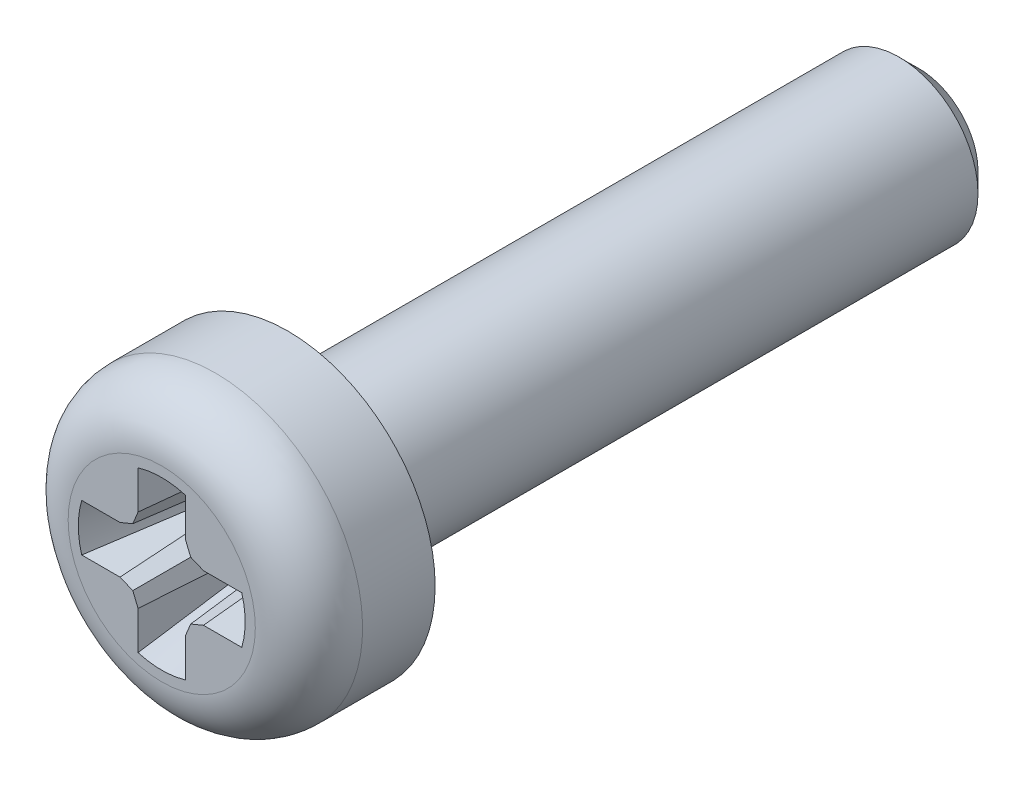
ISO-10303-21;
HEADER;
FILE_DESCRIPTION(('STEP AP214'),'2;1');
FILE_NAME('part.step','',(''),(''),'','','');
FILE_SCHEMA(('AUTOMOTIVE_DESIGN { 1 0 10303 214 1 1 1 1 }'));
ENDSEC;
DATA;
#1=APPLICATION_CONTEXT('core data for automotive mechanical design processes');
#2=APPLICATION_PROTOCOL_DEFINITION('international standard','automotive_design',2000,#1);
#3=PRODUCT_CONTEXT('',#1,'mechanical');
#4=PRODUCT('Part','Part','',(#3));
#5=PRODUCT_RELATED_PRODUCT_CATEGORY('part','',(#4));
#6=PRODUCT_DEFINITION_FORMATION('','',#4);
#7=PRODUCT_DEFINITION_CONTEXT('part definition',#1,'design');
#8=PRODUCT_DEFINITION('design','',#6,#7);
#9=PRODUCT_DEFINITION_SHAPE('','',#8);
#10=(LENGTH_UNIT() NAMED_UNIT(*) SI_UNIT(.MILLI.,.METRE.));
#11=(NAMED_UNIT(*) PLANE_ANGLE_UNIT() SI_UNIT($,.RADIAN.));
#12=(NAMED_UNIT(*) SI_UNIT($,.STERADIAN.) SOLID_ANGLE_UNIT());
#13=UNCERTAINTY_MEASURE_WITH_UNIT(LENGTH_MEASURE(1.E-05),#10,'distance_accuracy_value','');
#14=(GEOMETRIC_REPRESENTATION_CONTEXT(3) GLOBAL_UNCERTAINTY_ASSIGNED_CONTEXT((#13)) GLOBAL_UNIT_ASSIGNED_CONTEXT((#10,
#11,#12)) REPRESENTATION_CONTEXT('',''));
#15=CARTESIAN_POINT('',(0.,0.,0.));
#16=DIRECTION('',(0.,0.,1.));
#17=DIRECTION('',(1.,0.,0.));
#18=AXIS2_PLACEMENT_3D('',#15,#16,#17);
#19=CARTESIAN_POINT('',(0.,0.,0.));
#20=DIRECTION('',(0.,0.,1.));
#21=DIRECTION('',(1.,0.,0.));
#22=AXIS2_PLACEMENT_3D('',#19,#20,#21);
#23=PLANE('',#22);
#24=CARTESIAN_POINT('',(0.,0.,0.));
#25=DIRECTION('',(0.,0.,1.));
#26=DIRECTION('',(1.,0.,0.));
#27=AXIS2_PLACEMENT_3D('',#24,#25,#26);
#28=CIRCLE('',#27,2.8);
#29=CARTESIAN_POINT('',(2.8,0.,0.));
#30=VERTEX_POINT('',#29);
#31=EDGE_CURVE('E61',#30,#30,#28,.T.);
#32=ORIENTED_EDGE('',*,*,#31,.F.);
#33=EDGE_LOOP('',(#32));
#34=FACE_BOUND('',#33,.T.);
#35=CARTESIAN_POINT('',(0.,0.,0.));
#36=DIRECTION('',(0.,0.,1.));
#37=DIRECTION('',(1.,0.,0.));
#38=AXIS2_PLACEMENT_3D('',#35,#36,#37);
#39=CIRCLE('',#38,1.5);
#40=CARTESIAN_POINT('',(1.5,0.,0.));
#41=VERTEX_POINT('',#40);
#42=EDGE_CURVE('E11',#41,#41,#39,.F.);
#43=ORIENTED_EDGE('',*,*,#42,.F.);
#44=EDGE_LOOP('',(#43));
#45=FACE_BOUND('',#44,.T.);
#46=ADVANCED_FACE('F45',(#34,#45),#23,.F.);
#47=CARTESIAN_POINT('',(0.,0.,2.4));
#48=DIRECTION('',(0.,0.,-1.));
#49=DIRECTION('',(-1.,0.,0.));
#50=AXIS2_PLACEMENT_3D('',#47,#48,#49);
#51=CYLINDRICAL_SURFACE('',#50,2.8);
#52=CARTESIAN_POINT('',(0.,0.,1.38));
#53=DIRECTION('',(0.,0.,-1.));
#54=DIRECTION('',(0.,1.,0.));
#55=AXIS2_PLACEMENT_3D('',#52,#53,#54);
#56=CIRCLE('',#55,2.8);
#57=CARTESIAN_POINT('',(0.,2.8,1.38));
#58=VERTEX_POINT('',#57);
#59=EDGE_CURVE('E436',#58,#58,#56,.T.);
#60=ORIENTED_EDGE('',*,*,#59,.T.);
#61=EDGE_LOOP('',(#60));
#62=FACE_BOUND('',#61,.T.);
#63=ORIENTED_EDGE('',*,*,#31,.T.);
#64=EDGE_LOOP('',(#63));
#65=FACE_BOUND('',#64,.T.);
#66=ADVANCED_FACE('F371',(#62,#65),#51,.T.);
#67=CARTESIAN_POINT('',(0.,0.,1.38));
#68=DIRECTION('',(0.,0.,-1.));
#69=DIRECTION('',(0.,1.,0.));
#70=AXIS2_PLACEMENT_3D('',#67,#68,#69);
#71=TOROIDAL_SURFACE('',#70,1.78,1.02);
#72=ORIENTED_EDGE('',*,*,#59,.F.);
#73=EDGE_LOOP('',(#72));
#74=FACE_BOUND('',#73,.T.);
#75=CARTESIAN_POINT('',(0.,0.,2.4));
#76=DIRECTION('',(0.,0.,-1.));
#77=DIRECTION('',(0.,1.,0.));
#78=AXIS2_PLACEMENT_3D('',#75,#76,#77);
#79=CIRCLE('',#78,1.78);
#80=CARTESIAN_POINT('',(0.,1.78,2.4));
#81=VERTEX_POINT('',#80);
#82=EDGE_CURVE('E433',#81,#81,#79,.T.);
#83=ORIENTED_EDGE('',*,*,#82,.T.);
#84=EDGE_LOOP('',(#83));
#85=FACE_BOUND('',#84,.T.);
#86=ADVANCED_FACE('F379',(#74,#85),#71,.T.);
#87=CARTESIAN_POINT('',(0.,0.,2.4));
#88=DIRECTION('',(0.,0.,1.));
#89=DIRECTION('',(1.,0.,0.));
#90=AXIS2_PLACEMENT_3D('',#87,#88,#89);
#91=PLANE('',#90);
#92=DIRECTION('',(0.,-1.,0.));
#93=VECTOR('',#92,1.);
#94=CARTESIAN_POINT('',(-0.450000000000004,0.793749999999997,2.4));
#95=LINE('',#94,#93);
#96=CARTESIAN_POINT('',(-0.450000000000006,1.52238505313209,2.4));
#97=VERTEX_POINT('',#96);
#98=CARTESIAN_POINT('',(-0.450000000000004,0.793749999999997,2.4));
#99=VERTEX_POINT('',#98);
#100=EDGE_CURVE('E332',#97,#99,#95,.T.);
#101=ORIENTED_EDGE('',*,*,#100,.F.);
#102=CARTESIAN_POINT('',(0.,0.,2.4));
#103=DIRECTION('',(0.,0.,1.));
#104=DIRECTION('',(1.,0.,0.));
#105=AXIS2_PLACEMENT_3D('',#102,#103,#104);
#106=CIRCLE('',#105,1.5875);
#107=CARTESIAN_POINT('',(0.45,1.52238505313209,2.4));
#108=VERTEX_POINT('',#107);
#109=EDGE_CURVE('E337',#108,#97,#106,.T.);
#110=ORIENTED_EDGE('',*,*,#109,.F.);
#111=DIRECTION('',(0.,1.,0.));
#112=VECTOR('',#111,1.);
#113=CARTESIAN_POINT('',(0.45,1.52238505313209,2.4));
#114=LINE('',#113,#112);
#115=CARTESIAN_POINT('',(0.45,0.793749999999999,2.4));
#116=VERTEX_POINT('',#115);
#117=EDGE_CURVE('E425',#116,#108,#114,.T.);
#118=ORIENTED_EDGE('',*,*,#117,.F.);
#119=DIRECTION('',(-0.382683432365083,0.923879532511289,0.));
#120=VECTOR('',#119,1.);
#121=CARTESIAN_POINT('',(0.45,0.793749999999999,2.4));
#122=LINE('',#121,#120);
#123=CARTESIAN_POINT('',(0.550682043967123,0.550682043967123,2.4));
#124=VERTEX_POINT('',#123);
#125=EDGE_CURVE('E420',#124,#116,#122,.T.);
#126=ORIENTED_EDGE('',*,*,#125,.F.);
#127=DIRECTION('',(-0.92387953251129,0.382683432365083,0.));
#128=VECTOR('',#127,1.);
#129=CARTESIAN_POINT('',(0.793749999999998,0.450000000000001,2.4));
#130=LINE('',#129,#128);
#131=CARTESIAN_POINT('',(0.793749999999998,0.450000000000001,2.4));
#132=VERTEX_POINT('',#131);
#133=EDGE_CURVE('E198',#132,#124,#130,.T.);
#134=ORIENTED_EDGE('',*,*,#133,.F.);
#135=DIRECTION('',(-1.,0.,0.));
#136=VECTOR('',#135,1.);
#137=CARTESIAN_POINT('',(0.793749999999998,0.450000000000001,2.4));
#138=LINE('',#137,#136);
#139=CARTESIAN_POINT('',(1.52238505313209,0.450000000000001,2.4));
#140=VERTEX_POINT('',#139);
#141=EDGE_CURVE('E414',#140,#132,#138,.T.);
#142=ORIENTED_EDGE('',*,*,#141,.F.);
#143=CARTESIAN_POINT('',(0.,0.,2.4));
#144=DIRECTION('',(0.,0.,1.));
#145=DIRECTION('',(1.,0.,0.));
#146=AXIS2_PLACEMENT_3D('',#143,#144,#145);
#147=CIRCLE('',#146,1.5875);
#148=CARTESIAN_POINT('',(1.5223850531321,-0.449999999999984,2.4));
#149=VERTEX_POINT('',#148);
#150=EDGE_CURVE('E287',#149,#140,#147,.T.);
#151=ORIENTED_EDGE('',*,*,#150,.F.);
#152=DIRECTION('',(1.,0.,0.));
#153=VECTOR('',#152,1.);
#154=CARTESIAN_POINT('',(1.5223850531321,-0.449999999999984,2.4));
#155=LINE('',#154,#153);
#156=CARTESIAN_POINT('',(0.793750000000004,-0.449999999999992,2.4));
#157=VERTEX_POINT('',#156);
#158=EDGE_CURVE('E481',#157,#149,#155,.T.);
#159=ORIENTED_EDGE('',*,*,#158,.F.);
#160=DIRECTION('',(0.923879532511285,0.382683432365093,0.));
#161=VECTOR('',#160,1.);
#162=CARTESIAN_POINT('',(0.793750000000004,-0.449999999999992,2.4));
#163=LINE('',#162,#161);
#164=CARTESIAN_POINT('',(0.550682043967129,-0.550682043967117,2.4));
#165=VERTEX_POINT('',#164);
#166=EDGE_CURVE('E483',#165,#157,#163,.T.);
#167=ORIENTED_EDGE('',*,*,#166,.F.);
#168=DIRECTION('',(0.382683432365073,0.923879532511294,0.));
#169=VECTOR('',#168,1.);
#170=CARTESIAN_POINT('',(0.450000000000009,-0.793749999999994,2.4));
#171=LINE('',#170,#169);
#172=CARTESIAN_POINT('',(0.450000000000009,-0.793749999999994,2.4));
#173=VERTEX_POINT('',#172);
#174=EDGE_CURVE('E485',#173,#165,#171,.T.);
#175=ORIENTED_EDGE('',*,*,#174,.F.);
#176=DIRECTION('',(0.,1.,0.));
#177=VECTOR('',#176,1.);
#178=CARTESIAN_POINT('',(0.450000000000009,-0.793749999999994,2.4));
#179=LINE('',#178,#177);
#180=CARTESIAN_POINT('',(0.450000000000017,-1.52238505313209,2.4));
#181=VERTEX_POINT('',#180);
#182=EDGE_CURVE('E487',#181,#173,#179,.T.);
#183=ORIENTED_EDGE('',*,*,#182,.F.);
#184=CARTESIAN_POINT('',(0.,0.,2.4));
#185=DIRECTION('',(0.,0.,1.));
#186=DIRECTION('',(-1.,0.,0.));
#187=AXIS2_PLACEMENT_3D('',#184,#185,#186);
#188=CIRCLE('',#187,1.5875);
#189=CARTESIAN_POINT('',(-0.44999999999999,-1.52238505313209,2.4));
#190=VERTEX_POINT('',#189);
#191=EDGE_CURVE('E466',#190,#181,#188,.T.);
#192=ORIENTED_EDGE('',*,*,#191,.F.);
#193=DIRECTION('',(0.,-1.,0.));
#194=VECTOR('',#193,1.);
#195=CARTESIAN_POINT('',(-0.44999999999999,-1.52238505313209,2.4));
#196=LINE('',#195,#194);
#197=CARTESIAN_POINT('',(-0.449999999999995,-0.793750000000002,2.4));
#198=VERTEX_POINT('',#197);
#199=EDGE_CURVE('E469',#198,#190,#196,.T.);
#200=ORIENTED_EDGE('',*,*,#199,.F.);
#201=DIRECTION('',(0.38268343236509,-0.923879532511287,0.));
#202=VECTOR('',#201,1.);
#203=CARTESIAN_POINT('',(-0.449999999999995,-0.793750000000002,2.4));
#204=LINE('',#203,#202);
#205=CARTESIAN_POINT('',(-0.550682043967119,-0.550682043967127,2.4));
#206=VERTEX_POINT('',#205);
#207=EDGE_CURVE('E472',#206,#198,#204,.T.);
#208=ORIENTED_EDGE('',*,*,#207,.F.);
#209=DIRECTION('',(0.923879532511292,-0.382683432365077,0.));
#210=VECTOR('',#209,1.);
#211=CARTESIAN_POINT('',(-0.793749999999995,-0.450000000000007,2.4));
#212=LINE('',#211,#210);
#213=CARTESIAN_POINT('',(-0.793749999999995,-0.450000000000007,2.4));
#214=VERTEX_POINT('',#213);
#215=EDGE_CURVE('E475',#214,#206,#212,.T.);
#216=ORIENTED_EDGE('',*,*,#215,.F.);
#217=DIRECTION('',(1.,0.,0.));
#218=VECTOR('',#217,1.);
#219=CARTESIAN_POINT('',(-0.793749999999995,-0.450000000000007,2.4));
#220=LINE('',#219,#218);
#221=CARTESIAN_POINT('',(-1.52238505313209,-0.450000000000012,2.4));
#222=VERTEX_POINT('',#221);
#223=EDGE_CURVE('E478',#222,#214,#220,.T.);
#224=ORIENTED_EDGE('',*,*,#223,.F.);
#225=CARTESIAN_POINT('',(0.,0.,2.4));
#226=DIRECTION('',(0.,0.,1.));
#227=DIRECTION('',(0.,1.,0.));
#228=AXIS2_PLACEMENT_3D('',#225,#226,#227);
#229=CIRCLE('',#228,1.5875);
#230=CARTESIAN_POINT('',(-1.52238505313209,0.449999999999995,2.4));
#231=VERTEX_POINT('',#230);
#232=EDGE_CURVE('E143',#231,#222,#229,.T.);
#233=ORIENTED_EDGE('',*,*,#232,.F.);
#234=DIRECTION('',(-1.,0.,0.));
#235=VECTOR('',#234,1.);
#236=CARTESIAN_POINT('',(-1.52238505313209,0.449999999999995,2.4));
#237=LINE('',#236,#235);
#238=CARTESIAN_POINT('',(-0.79375,0.449999999999998,2.4));
#239=VERTEX_POINT('',#238);
#240=EDGE_CURVE('E455',#239,#231,#237,.T.);
#241=ORIENTED_EDGE('',*,*,#240,.F.);
#242=DIRECTION('',(-0.923879532511288,-0.382683432365087,0.));
#243=VECTOR('',#242,1.);
#244=CARTESIAN_POINT('',(-0.79375,0.449999999999998,2.4));
#245=LINE('',#244,#243);
#246=CARTESIAN_POINT('',(-0.550682043967125,0.550682043967121,2.4));
#247=VERTEX_POINT('',#246);
#248=EDGE_CURVE('E457',#247,#239,#245,.T.);
#249=ORIENTED_EDGE('',*,*,#248,.F.);
#250=DIRECTION('',(-0.38268343236508,-0.923879532511291,0.));
#251=VECTOR('',#250,1.);
#252=CARTESIAN_POINT('',(-0.450000000000004,0.793749999999997,2.4));
#253=LINE('',#252,#251);
#254=EDGE_CURVE('E462',#99,#247,#253,.T.);
#255=ORIENTED_EDGE('',*,*,#254,.F.);
#256=EDGE_LOOP('',(#101,#110,#118,#126,#134,#142,#151,#159,#167,#175,#183,#192,#200,#208,#216,
#224,#233,#241,#249,#255));
#257=FACE_BOUND('',#256,.T.);
#258=ORIENTED_EDGE('',*,*,#82,.F.);
#259=EDGE_LOOP('',(#258));
#260=FACE_BOUND('',#259,.T.);
#261=ADVANCED_FACE('F384',(#257,#260),#91,.T.);
#262=CARTESIAN_POINT('',(0.,0.,-12.));
#263=DIRECTION('',(0.,0.,1.));
#264=DIRECTION('',(1.,0.,0.));
#265=AXIS2_PLACEMENT_3D('',#262,#263,#264);
#266=PLANE('',#265);
#267=CARTESIAN_POINT('',(0.,0.,-12.));
#268=DIRECTION('',(0.,0.,1.));
#269=DIRECTION('',(1.,0.,0.));
#270=AXIS2_PLACEMENT_3D('',#267,#268,#269);
#271=CIRCLE('',#270,1.125);
#272=CARTESIAN_POINT('',(1.125,0.,-12.));
#273=VERTEX_POINT('',#272);
#274=EDGE_CURVE('E430',#273,#273,#271,.F.);
#275=ORIENTED_EDGE('',*,*,#274,.T.);
#276=EDGE_LOOP('',(#275));
#277=FACE_BOUND('',#276,.T.);
#278=ADVANCED_FACE('F387',(#277),#266,.F.);
#279=CARTESIAN_POINT('',(0.,0.,0.));
#280=DIRECTION('',(0.,0.,1.));
#281=DIRECTION('',(1.,0.,0.));
#282=AXIS2_PLACEMENT_3D('',#279,#280,#281);
#283=CYLINDRICAL_SURFACE('',#282,1.5);
#284=CARTESIAN_POINT('',(0.,0.,-11.625));
#285=DIRECTION('',(0.,0.,1.));
#286=DIRECTION('',(1.,0.,0.));
#287=AXIS2_PLACEMENT_3D('',#284,#285,#286);
#288=CIRCLE('',#287,1.5);
#289=CARTESIAN_POINT('',(1.5,0.,-11.625));
#290=VERTEX_POINT('',#289);
#291=EDGE_CURVE('E228',#290,#290,#288,.T.);
#292=ORIENTED_EDGE('',*,*,#291,.T.);
#293=EDGE_LOOP('',(#292));
#294=FACE_BOUND('',#293,.T.);
#295=ORIENTED_EDGE('',*,*,#42,.T.);
#296=EDGE_LOOP('',(#295));
#297=FACE_BOUND('',#296,.T.);
#298=ADVANCED_FACE('F393',(#294,#297),#283,.T.);
#299=CARTESIAN_POINT('',(0.,0.,-11.625));
#300=DIRECTION('',(0.,0.,1.));
#301=DIRECTION('',(1.,0.,0.));
#302=AXIS2_PLACEMENT_3D('',#299,#300,#301);
#303=CONICAL_SURFACE('',#302,1.5,0.785398163397451);
#304=CARTESIAN_POINT('',(1.125,0.,-12.));
#305=CARTESIAN_POINT('',(1.12890625,0.,-11.99609375));
#306=CARTESIAN_POINT('',(1.1328125,0.,-11.9921875));
#307=CARTESIAN_POINT('',(1.140625,0.,-11.984375));
#308=CARTESIAN_POINT('',(1.14453125,0.,-11.98046875));
#309=CARTESIAN_POINT('',(1.15234375,0.,-11.97265625));
#310=CARTESIAN_POINT('',(1.15625,0.,-11.96875));
#311=CARTESIAN_POINT('',(1.1640625,0.,-11.9609375));
#312=CARTESIAN_POINT('',(1.16796875,0.,-11.95703125));
#313=CARTESIAN_POINT('',(1.17578125,0.,-11.94921875));
#314=CARTESIAN_POINT('',(1.1796875,0.,-11.9453125));
#315=CARTESIAN_POINT('',(1.1875,0.,-11.9375));
#316=CARTESIAN_POINT('',(1.19140625,0.,-11.93359375));
#317=CARTESIAN_POINT('',(1.19921875,0.,-11.92578125));
#318=CARTESIAN_POINT('',(1.203125,0.,-11.921875));
#319=CARTESIAN_POINT('',(1.2109375,0.,-11.9140625));
#320=CARTESIAN_POINT('',(1.21484375,0.,-11.91015625));
#321=CARTESIAN_POINT('',(1.22265625,0.,-11.90234375));
#322=CARTESIAN_POINT('',(1.2265625,0.,-11.8984375));
#323=CARTESIAN_POINT('',(1.234375,0.,-11.890625));
#324=CARTESIAN_POINT('',(1.23828125,0.,-11.88671875));
#325=CARTESIAN_POINT('',(1.24609375,0.,-11.87890625));
#326=CARTESIAN_POINT('',(1.25,0.,-11.875));
#327=CARTESIAN_POINT('',(1.2578125,0.,-11.8671875));
#328=CARTESIAN_POINT('',(1.26171875,0.,-11.86328125));
#329=CARTESIAN_POINT('',(1.26953125,0.,-11.85546875));
#330=CARTESIAN_POINT('',(1.2734375,0.,-11.8515625));
#331=CARTESIAN_POINT('',(1.28125,0.,-11.84375));
#332=CARTESIAN_POINT('',(1.28515625,0.,-11.83984375));
#333=CARTESIAN_POINT('',(1.29296875,0.,-11.83203125));
#334=CARTESIAN_POINT('',(1.296875,0.,-11.828125));
#335=CARTESIAN_POINT('',(1.3046875,0.,-11.8203125));
#336=CARTESIAN_POINT('',(1.30859375,0.,-11.81640625));
#337=CARTESIAN_POINT('',(1.31640625,0.,-11.80859375));
#338=CARTESIAN_POINT('',(1.3203125,0.,-11.8046875));
#339=CARTESIAN_POINT('',(1.328125,0.,-11.796875));
#340=CARTESIAN_POINT('',(1.33203125,0.,-11.79296875));
#341=CARTESIAN_POINT('',(1.33984375,0.,-11.78515625));
#342=CARTESIAN_POINT('',(1.34375,0.,-11.78125));
#343=CARTESIAN_POINT('',(1.3515625,0.,-11.7734375));
#344=CARTESIAN_POINT('',(1.35546875,0.,-11.76953125));
#345=CARTESIAN_POINT('',(1.36328125,0.,-11.76171875));
#346=CARTESIAN_POINT('',(1.3671875,0.,-11.7578125));
#347=CARTESIAN_POINT('',(1.375,0.,-11.75));
#348=CARTESIAN_POINT('',(1.37890625,0.,-11.74609375));
#349=CARTESIAN_POINT('',(1.38671875,0.,-11.73828125));
#350=CARTESIAN_POINT('',(1.390625,0.,-11.734375));
#351=CARTESIAN_POINT('',(1.3984375,0.,-11.7265625));
#352=CARTESIAN_POINT('',(1.40234375,0.,-11.72265625));
#353=CARTESIAN_POINT('',(1.41015625,0.,-11.71484375));
#354=CARTESIAN_POINT('',(1.4140625,0.,-11.7109375));
#355=CARTESIAN_POINT('',(1.421875,0.,-11.703125));
#356=CARTESIAN_POINT('',(1.42578125,0.,-11.69921875));
#357=CARTESIAN_POINT('',(1.43359375,0.,-11.69140625));
#358=CARTESIAN_POINT('',(1.4375,0.,-11.6875));
#359=CARTESIAN_POINT('',(1.4453125,0.,-11.6796875));
#360=CARTESIAN_POINT('',(1.44921875,0.,-11.67578125));
#361=CARTESIAN_POINT('',(1.45703125,0.,-11.66796875));
#362=CARTESIAN_POINT('',(1.4609375,0.,-11.6640625));
#363=CARTESIAN_POINT('',(1.46875,0.,-11.65625));
#364=CARTESIAN_POINT('',(1.47265625,0.,-11.65234375));
#365=CARTESIAN_POINT('',(1.48046875,0.,-11.64453125));
#366=CARTESIAN_POINT('',(1.484375,0.,-11.640625));
#367=CARTESIAN_POINT('',(1.4921875,0.,-11.6328125));
#368=CARTESIAN_POINT('',(1.49609375,0.,-11.62890625));
#369=CARTESIAN_POINT('',(1.5,0.,-11.625));
#370=B_SPLINE_CURVE_WITH_KNOTS('',3,(#304,#305,#306,#307,#308,#309,#310,#311,#312,#313,#314,
#315,#316,#317,#318,#319,#320,#321,#322,#323,#324,#325,#326,#327,#328,#329,#330,#331,#332,#333,
#334,#335,#336,#337,#338,#339,#340,#341,#342,#343,#344,#345,#346,#347,#348,#349,#350,#351,#352,
#353,#354,#355,#356,#357,#358,#359,#360,#361,#362,#363,#364,#365,#366,#367,#368,#369),
.UNSPECIFIED.,.F.,.F.,(4,2,2,2,2,2,2,2,2,2,2,2,2,2,2,2,2,2,2,2,2,2,2,2,2,2,2,2,2,2,2,2,4),(0.,
0.01657281518406,0.0331456303681201,0.0497184455521801,0.0662912607362389,0.0828640759202988,
0.0994368911043588,0.116009706288418,0.132582521472478,0.149155336656538,0.165728151840596,
0.182300967024656,0.198873782208717,0.215446597392775,0.232019412576835,0.248592227760895,
0.265165042944954,0.281737858129014,0.298310673313074,0.314883488497134,0.331456303681193,
0.348029118865253,0.364601934049313,0.381174749233372,0.397747564417432,0.414320379601492,
0.43089319478555,0.44746600996961,0.46403882515367,0.480611640337729,0.497184455521789,
0.513757270705849,0.530330085889909),.UNSPECIFIED.);
#371=EDGE_CURVE('BSEAM237',#273,#290,#370,.T.);
#372=ORIENTED_EDGE('',*,*,#274,.F.);
#373=ORIENTED_EDGE('',*,*,#291,.F.);
#374=ORIENTED_EDGE('',*,*,#371,.T.);
#375=ORIENTED_EDGE('',*,*,#371,.F.);
#376=EDGE_LOOP('',(#372,#374,#373,#375));
#377=FACE_BOUND('',#376,.T.);
#378=ADVANCED_FACE('F237',(#377),#303,.T.);
#379=CARTESIAN_POINT('',(0.,0.,2.4));
#380=DIRECTION('',(0.,0.,1.));
#381=DIRECTION('',(1.,0.,0.));
#382=AXIS2_PLACEMENT_3D('',#379,#380,#381);
#383=CONICAL_SURFACE('',#382,1.5875,0.26179938779915);
#384=ORIENTED_EDGE('',*,*,#109,.T.);
#385=CARTESIAN_POINT('',(-0.450000000000006,1.52238505313209,2.4));
#386=CARTESIAN_POINT('',(-0.414477744167481,1.41945884722323,1.99397875792218));
#387=CARTESIAN_POINT('',(-0.378956515806402,1.31648600397113,1.58796925989672));
#388=CARTESIAN_POINT('',(-0.30791611378637,1.11044704208215,0.775973749198562));
#389=CARTESIAN_POINT('',(-0.27239694012743,1.00738092344464,0.36998773652602));
#390=CARTESIAN_POINT('',(-0.23687879393995,0.904268167463262,-0.0359865320939932));
#391=B_SPLINE_CURVE_WITH_KNOTS('',3,(#385,#386,#387,#388,#389,#390),.UNSPECIFIED.,.F.,.F.,(4,2,
4),(0.,1.26110264823577,2.52220530501969),.UNSPECIFIED.);
#392=CARTESIAN_POINT('',(-0.271523126407119,1.00484524148506,0.36));
#393=VERTEX_POINT('',#392);
#394=EDGE_CURVE('E246',#393,#97,#391,.F.);
#395=ORIENTED_EDGE('',*,*,#394,.F.);
#396=CARTESIAN_POINT('',(0.,0.,0.36));
#397=DIRECTION('',(0.,0.,1.));
#398=DIRECTION('',(1.,0.,0.));
#399=AXIS2_PLACEMENT_3D('',#396,#397,#398);
#400=CIRCLE('',#399,1.04088364744051);
#401=CARTESIAN_POINT('',(0.271523126407115,1.00484524148506,0.36));
#402=VERTEX_POINT('',#401);
#403=EDGE_CURVE('E220',#402,#393,#400,.T.);
#404=ORIENTED_EDGE('',*,*,#403,.F.);
#405=CARTESIAN_POINT('',(0.271523126407115,1.00484524148506,0.36));
#406=CARTESIAN_POINT('',(0.318101305021576,1.13999510788411,0.892391017730642));
#407=CARTESIAN_POINT('',(0.364680851628295,1.27508285783648,1.42479767168435));
#408=CARTESIAN_POINT('',(0.424174405695201,1.44753878525971,2.10481210634625));
#409=CARTESIAN_POINT('',(0.43708715028611,1.48496430585635,2.25240545239254));
#410=CARTESIAN_POINT('',(0.45,1.52238505313209,2.4));
#411=B_SPLINE_CURVE_WITH_KNOTS('',3,(#405,#406,#407,#408,#409,#410),.UNSPECIFIED.,.F.,.F.,(4,2,
4),(0.,1.65374629121617,2.11217931713975),.UNSPECIFIED.);
#412=EDGE_CURVE('E70',#402,#108,#411,.T.);
#413=ORIENTED_EDGE('',*,*,#412,.T.);
#414=EDGE_LOOP('',(#384,#395,#404,#413));
#415=FACE_BOUND('',#414,.T.);
#416=ADVANCED_FACE('F234',(#415),#383,.F.);
#417=CARTESIAN_POINT('',(0.45,1.52238505313209,2.4));
#418=DIRECTION('',(-0.996194698091746,0.,0.0871557427476584));
#419=DIRECTION('',(0.0871557427476584,0.,0.996194698091746));
#420=AXIS2_PLACEMENT_3D('',#417,#418,#419);
#421=PLANE('',#420);
#422=ORIENTED_EDGE('',*,*,#117,.T.);
#423=ORIENTED_EDGE('',*,*,#412,.F.);
#424=DIRECTION('',(0.,-1.,0.));
#425=VECTOR('',#424,1.);
#426=CARTESIAN_POINT('',(0.271523126407115,0.,0.36));
#427=LINE('',#426,#425);
#428=CARTESIAN_POINT('',(0.271523126407115,0.758248742551119,0.36));
#429=VERTEX_POINT('',#428);
#430=EDGE_CURVE('E210',#429,#402,#427,.F.);
#431=ORIENTED_EDGE('',*,*,#430,.F.);
#432=DIRECTION('',(0.0871426484044397,0.01733375049386,0.996045029063886));
#433=VECTOR('',#432,1.);
#434=CARTESIAN_POINT('',(0.451100609750691,0.79396892489107,2.41258002701532));
#435=LINE('',#434,#433);
#436=EDGE_CURVE('E202',#429,#116,#435,.T.);
#437=ORIENTED_EDGE('',*,*,#436,.T.);
#438=EDGE_LOOP('',(#422,#423,#431,#437));
#439=FACE_BOUND('',#438,.T.);
#440=ADVANCED_FACE('F230',(#439),#421,.T.);
#441=CARTESIAN_POINT('',(0.45,0.793749999999999,2.4));
#442=DIRECTION('',(-0.920363891963227,-0.381227206369647,0.0871557427476584));
#443=DIRECTION('',(0.382683432365083,-0.92387953251129,0.));
#444=AXIS2_PLACEMENT_3D('',#441,#442,#443);
#445=PLANE('',#444);
#446=ORIENTED_EDGE('',*,*,#125,.T.);
#447=ORIENTED_EDGE('',*,*,#436,.F.);
#448=DIRECTION('',(0.382683432365083,-0.92387953251129,0.));
#449=VECTOR('',#448,1.);
#450=CARTESIAN_POINT('',(0.499840899011311,0.207040879399241,0.36));
#451=LINE('',#450,#449);
#452=CARTESIAN_POINT('',(0.414081758798491,0.414081758798492,0.36));
#453=VERTEX_POINT('',#452);
#454=EDGE_CURVE('E206',#453,#429,#451,.F.);
#455=ORIENTED_EDGE('',*,*,#454,.F.);
#456=DIRECTION('',(0.0666626913468326,0.0666626913468326,0.995546167269401));
#457=VECTOR('',#456,1.);
#458=CARTESIAN_POINT('',(0.551314794774615,0.551314794774616,2.40944955309347));
#459=LINE('',#458,#457);
#460=EDGE_CURVE('E191',#453,#124,#459,.T.);
#461=ORIENTED_EDGE('',*,*,#460,.T.);
#462=EDGE_LOOP('',(#446,#447,#455,#461));
#463=FACE_BOUND('',#462,.T.);
#464=ADVANCED_FACE('F207',(#463),#445,.T.);
#465=CARTESIAN_POINT('',(0.793749999999998,0.450000000000001,2.4));
#466=DIRECTION('',(-0.381227206369647,-0.920363891963227,0.0871557427476584));
#467=DIRECTION('',(0.92387953251129,-0.382683432365083,0.));
#468=AXIS2_PLACEMENT_3D('',#465,#466,#467);
#469=PLANE('',#468);
#470=ORIENTED_EDGE('',*,*,#133,.T.);
#471=ORIENTED_EDGE('',*,*,#460,.F.);
#472=DIRECTION('',(0.92387953251129,-0.382683432365083,0.));
#473=VECTOR('',#472,1.);
#474=CARTESIAN_POINT('',(0.207040879399241,0.499840899011311,0.36));
#475=LINE('',#474,#473);
#476=CARTESIAN_POINT('',(0.758248742551118,0.271523126407116,0.36));
#477=VERTEX_POINT('',#476);
#478=EDGE_CURVE('E195',#477,#453,#475,.F.);
#479=ORIENTED_EDGE('',*,*,#478,.F.);
#480=DIRECTION('',(0.0173337504938599,0.0871426484044397,0.996045029063886));
#481=VECTOR('',#480,1.);
#482=CARTESIAN_POINT('',(0.793749999999998,0.450000000000001,2.4));
#483=LINE('',#482,#481);
#484=EDGE_CURVE('E203',#477,#132,#483,.T.);
#485=ORIENTED_EDGE('',*,*,#484,.T.);
#486=EDGE_LOOP('',(#470,#471,#479,#485));
#487=FACE_BOUND('',#486,.T.);
#488=ADVANCED_FACE('F193',(#487),#469,.T.);
#489=CARTESIAN_POINT('',(0.793749999999998,0.450000000000001,2.4));
#490=DIRECTION('',(0.,-0.996194698091745,0.0871557427476584));
#491=DIRECTION('',(0.,-0.0871557427476584,-0.996194698091746));
#492=AXIS2_PLACEMENT_3D('',#489,#490,#491);
#493=PLANE('',#492);
#494=ORIENTED_EDGE('',*,*,#141,.T.);
#495=ORIENTED_EDGE('',*,*,#484,.F.);
#496=DIRECTION('',(1.,0.,0.));
#497=VECTOR('',#496,1.);
#498=CARTESIAN_POINT('',(0.,0.271523126407116,0.36));
#499=LINE('',#498,#497);
#500=CARTESIAN_POINT('',(1.00484524148506,0.271523126407116,0.36));
#501=VERTEX_POINT('',#500);
#502=EDGE_CURVE('E214',#501,#477,#499,.F.);
#503=ORIENTED_EDGE('',*,*,#502,.F.);
#504=CARTESIAN_POINT('',(1.52238505313209,0.450000000000001,2.4));
#505=CARTESIAN_POINT('',(1.41945884722323,0.414477744167476,1.99397875792218));
#506=CARTESIAN_POINT('',(1.31648600397113,0.378956515806398,1.58796925989672));
#507=CARTESIAN_POINT('',(1.11044704208215,0.307916113786366,0.775973749198562));
#508=CARTESIAN_POINT('',(1.00738092344464,0.272396940127426,0.36998773652602));
#509=CARTESIAN_POINT('',(0.904268167463263,0.236878793939947,-0.0359865320939933));
#510=B_SPLINE_CURVE_WITH_KNOTS('',3,(#504,#505,#506,#507,#508,#509),.UNSPECIFIED.,.F.,.F.,(4,2,
4),(0.,1.26110264823577,2.52220530501969),.UNSPECIFIED.);
#511=EDGE_CURVE('E411',#501,#140,#510,.F.);
#512=ORIENTED_EDGE('',*,*,#511,.T.);
#513=EDGE_LOOP('',(#494,#495,#503,#512));
#514=FACE_BOUND('',#513,.T.);
#515=ADVANCED_FACE('F242',(#514),#493,.T.);
#516=CARTESIAN_POINT('',(0.,0.,2.4));
#517=DIRECTION('',(0.,0.,1.));
#518=DIRECTION('',(1.,0.,0.));
#519=AXIS2_PLACEMENT_3D('',#516,#517,#518);
#520=CONICAL_SURFACE('',#519,1.5875,0.26179938779915);
#521=ORIENTED_EDGE('',*,*,#150,.T.);
#522=ORIENTED_EDGE('',*,*,#511,.F.);
#523=CARTESIAN_POINT('',(0.,0.,0.36));
#524=DIRECTION('',(0.,0.,1.));
#525=DIRECTION('',(1.,0.,0.));
#526=AXIS2_PLACEMENT_3D('',#523,#524,#525);
#527=CIRCLE('',#526,1.04088364744051);
#528=CARTESIAN_POINT('',(1.00484524148506,-0.271523126407104,0.36));
#529=VERTEX_POINT('',#528);
#530=EDGE_CURVE('E134',#529,#501,#527,.T.);
#531=ORIENTED_EDGE('',*,*,#530,.F.);
#532=CARTESIAN_POINT('',(1.00484524148506,-0.271523126407104,0.36));
#533=CARTESIAN_POINT('',(1.13999510788411,-0.318101305021564,0.892391017730642));
#534=CARTESIAN_POINT('',(1.27508285783649,-0.364680851628282,1.42479767168435));
#535=CARTESIAN_POINT('',(1.44753878525972,-0.424174405695186,2.10481210634625));
#536=CARTESIAN_POINT('',(1.48496430585636,-0.437087150286095,2.25240545239254));
#537=CARTESIAN_POINT('',(1.5223850531321,-0.449999999999984,2.4));
#538=B_SPLINE_CURVE_WITH_KNOTS('',3,(#532,#533,#534,#535,#536,#537),.UNSPECIFIED.,.F.,.F.,(4,2,
4),(0.,1.65374629121617,2.11217931713975),.UNSPECIFIED.);
#539=EDGE_CURVE('E49',#529,#149,#538,.T.);
#540=ORIENTED_EDGE('',*,*,#539,.T.);
#541=EDGE_LOOP('',(#521,#522,#531,#540));
#542=FACE_BOUND('',#541,.T.);
#543=ADVANCED_FACE('F239',(#542),#520,.F.);
#544=CARTESIAN_POINT('',(0.,0.,0.36));
#545=DIRECTION('',(0.,0.,1.));
#546=DIRECTION('',(1.,0.,0.));
#547=AXIS2_PLACEMENT_3D('',#544,#545,#546);
#548=PLANE('',#547);
#549=ORIENTED_EDGE('',*,*,#403,.T.);
#550=DIRECTION('',(0.,1.,0.));
#551=VECTOR('',#550,1.);
#552=CARTESIAN_POINT('',(-0.271523126407116,0.,0.36));
#553=LINE('',#552,#551);
#554=CARTESIAN_POINT('',(-0.271523126407118,0.758248742551118,0.36));
#555=VERTEX_POINT('',#554);
#556=EDGE_CURVE('E259',#393,#555,#553,.F.);
#557=ORIENTED_EDGE('',*,*,#556,.T.);
#558=DIRECTION('',(0.38268343236508,0.923879532511291,0.));
#559=VECTOR('',#558,1.);
#560=CARTESIAN_POINT('',(-0.499840899011312,0.20704087939924,0.36));
#561=LINE('',#560,#559);
#562=CARTESIAN_POINT('',(-0.414081758798493,0.41408175879849,0.36));
#563=VERTEX_POINT('',#562);
#564=EDGE_CURVE('E453',#555,#563,#561,.F.);
#565=ORIENTED_EDGE('',*,*,#564,.T.);
#566=DIRECTION('',(0.923879532511288,0.382683432365087,0.));
#567=VECTOR('',#566,1.);
#568=CARTESIAN_POINT('',(-0.207040879399243,0.49984089901131,0.36));
#569=LINE('',#568,#567);
#570=CARTESIAN_POINT('',(-0.75824874255112,0.271523126407112,0.36));
#571=VERTEX_POINT('',#570);
#572=EDGE_CURVE('E454',#563,#571,#569,.F.);
#573=ORIENTED_EDGE('',*,*,#572,.T.);
#574=DIRECTION('',(1.,0.,0.));
#575=VECTOR('',#574,1.);
#576=CARTESIAN_POINT('',(0.,0.271523126407115,0.36));
#577=LINE('',#576,#575);
#578=CARTESIAN_POINT('',(-1.00484524148506,0.271523126407112,0.36));
#579=VERTEX_POINT('',#578);
#580=EDGE_CURVE('E288',#571,#579,#577,.F.);
#581=ORIENTED_EDGE('',*,*,#580,.T.);
#582=CARTESIAN_POINT('',(0.,0.,0.36));
#583=DIRECTION('',(0.,0.,1.));
#584=DIRECTION('',(1.,0.,0.));
#585=AXIS2_PLACEMENT_3D('',#582,#583,#584);
#586=CIRCLE('',#585,1.04088364744051);
#587=CARTESIAN_POINT('',(-1.00484524148505,-0.271523126407123,0.36));
#588=VERTEX_POINT('',#587);
#589=EDGE_CURVE('E256',#579,#588,#586,.T.);
#590=ORIENTED_EDGE('',*,*,#589,.T.);
#591=DIRECTION('',(-1.,0.,0.));
#592=VECTOR('',#591,1.);
#593=CARTESIAN_POINT('',(0.,-0.271523126407116,0.36));
#594=LINE('',#593,#592);
#595=CARTESIAN_POINT('',(-0.758248742551117,-0.271523126407121,0.36));
#596=VERTEX_POINT('',#595);
#597=EDGE_CURVE('E308',#588,#596,#594,.F.);
#598=ORIENTED_EDGE('',*,*,#597,.T.);
#599=DIRECTION('',(-0.923879532511292,0.382683432365077,0.));
#600=VECTOR('',#599,1.);
#601=CARTESIAN_POINT('',(-0.207040879399238,-0.499840899011313,0.36));
#602=LINE('',#601,#600);
#603=CARTESIAN_POINT('',(-0.414081758798488,-0.414081758798494,0.36));
#604=VERTEX_POINT('',#603);
#605=EDGE_CURVE('E708',#596,#604,#602,.F.);
#606=ORIENTED_EDGE('',*,*,#605,.T.);
#607=DIRECTION('',(-0.38268343236509,0.923879532511287,0.));
#608=VECTOR('',#607,1.);
#609=CARTESIAN_POINT('',(-0.49984089901131,-0.207040879399245,0.36));
#610=LINE('',#609,#608);
#611=CARTESIAN_POINT('',(-0.27152312640711,-0.758248742551121,0.36));
#612=VERTEX_POINT('',#611);
#613=EDGE_CURVE('E514',#604,#612,#610,.F.);
#614=ORIENTED_EDGE('',*,*,#613,.T.);
#615=DIRECTION('',(0.,1.,0.));
#616=VECTOR('',#615,1.);
#617=CARTESIAN_POINT('',(-0.271523126407115,0.,0.36));
#618=LINE('',#617,#616);
#619=CARTESIAN_POINT('',(-0.271523126407108,-1.00484524148506,0.36));
#620=VERTEX_POINT('',#619);
#621=EDGE_CURVE('E333',#612,#620,#618,.F.);
#622=ORIENTED_EDGE('',*,*,#621,.T.);
#623=CARTESIAN_POINT('',(0.,0.,0.36));
#624=DIRECTION('',(0.,0.,1.));
#625=DIRECTION('',(1.,0.,0.));
#626=AXIS2_PLACEMENT_3D('',#623,#624,#625);
#627=CIRCLE('',#626,1.04088364744051);
#628=CARTESIAN_POINT('',(0.271523126407126,-1.00484524148505,0.36));
#629=VERTEX_POINT('',#628);
#630=EDGE_CURVE('E305',#620,#629,#627,.T.);
#631=ORIENTED_EDGE('',*,*,#630,.T.);
#632=DIRECTION('',(0.,-1.,0.));
#633=VECTOR('',#632,1.);
#634=CARTESIAN_POINT('',(0.271523126407116,0.,0.36));
#635=LINE('',#634,#633);
#636=CARTESIAN_POINT('',(0.271523126407123,-0.758248742551116,0.36));
#637=VERTEX_POINT('',#636);
#638=EDGE_CURVE('E354',#629,#637,#635,.F.);
#639=ORIENTED_EDGE('',*,*,#638,.T.);
#640=DIRECTION('',(-0.382683432365073,-0.923879532511294,0.));
#641=VECTOR('',#640,1.);
#642=CARTESIAN_POINT('',(0.499840899011313,-0.207040879399236,0.36));
#643=LINE('',#642,#641);
#644=CARTESIAN_POINT('',(0.414081758798496,-0.414081758798487,0.36));
#645=VERTEX_POINT('',#644);
#646=EDGE_CURVE('E712',#637,#645,#643,.F.);
#647=ORIENTED_EDGE('',*,*,#646,.T.);
#648=DIRECTION('',(-0.923879532511286,-0.382683432365093,0.));
#649=VECTOR('',#648,1.);
#650=CARTESIAN_POINT('',(0.207040879399247,-0.499840899011309,0.36));
#651=LINE('',#650,#649);
#652=CARTESIAN_POINT('',(0.758248742551122,-0.271523126407107,0.36));
#653=VERTEX_POINT('',#652);
#654=EDGE_CURVE('E713',#645,#653,#651,.F.);
#655=ORIENTED_EDGE('',*,*,#654,.T.);
#656=DIRECTION('',(-1.,0.,0.));
#657=VECTOR('',#656,1.);
#658=CARTESIAN_POINT('',(0.,-0.271523126407115,0.36));
#659=LINE('',#658,#657);
#660=EDGE_CURVE('E353',#653,#529,#659,.F.);
#661=ORIENTED_EDGE('',*,*,#660,.T.);
#662=ORIENTED_EDGE('',*,*,#530,.T.);
#663=ORIENTED_EDGE('',*,*,#502,.T.);
#664=ORIENTED_EDGE('',*,*,#478,.T.);
#665=ORIENTED_EDGE('',*,*,#454,.T.);
#666=ORIENTED_EDGE('',*,*,#430,.T.);
#667=EDGE_LOOP('',(#549,#557,#565,#573,#581,#590,#598,#606,#614,#622,#631,#639,#647,#655,#661,
#662,#663,#664,#665,#666));
#668=FACE_BOUND('',#667,.T.);
#669=ADVANCED_FACE('F212',(#668),#548,.T.);
#670=CARTESIAN_POINT('',(0.,0.,2.4));
#671=DIRECTION('',(0.,0.,1.));
#672=DIRECTION('',(0.,1.,0.));
#673=AXIS2_PLACEMENT_3D('',#670,#671,#672);
#674=CONICAL_SURFACE('',#673,1.5875,0.26179938779915);
#675=ORIENTED_EDGE('',*,*,#232,.T.);
#676=CARTESIAN_POINT('',(-1.52238505313209,-0.450000000000012,2.4));
#677=CARTESIAN_POINT('',(-1.41945884722323,-0.414477744167486,1.99397875792218));
#678=CARTESIAN_POINT('',(-1.31648600397113,-0.378956515806407,1.58796925989672));
#679=CARTESIAN_POINT('',(-1.11044704208215,-0.307916113786373,0.775973749198562));
#680=CARTESIAN_POINT('',(-1.00738092344464,-0.272396940127433,0.36998773652602));
#681=CARTESIAN_POINT('',(-0.904268167463262,-0.236878793939953,-0.0359865320939933));
#682=B_SPLINE_CURVE_WITH_KNOTS('',3,(#676,#677,#678,#679,#680,#681),.UNSPECIFIED.,.F.,.F.,(4,2,
4),(0.,1.26110264823577,2.52220530501969),.UNSPECIFIED.);
#683=EDGE_CURVE('E296',#588,#222,#682,.F.);
#684=ORIENTED_EDGE('',*,*,#683,.F.);
#685=ORIENTED_EDGE('',*,*,#589,.F.);
#686=CARTESIAN_POINT('',(-1.00484524148506,0.271523126407112,0.36));
#687=CARTESIAN_POINT('',(-1.13999510788411,0.318101305021572,0.892391017730642));
#688=CARTESIAN_POINT('',(-1.27508285783648,0.364680851628291,1.42479767168435));
#689=CARTESIAN_POINT('',(-1.44753878525971,0.424174405695196,2.10481210634625));
#690=CARTESIAN_POINT('',(-1.48496430585635,0.437087150286105,2.25240545239254));
#691=CARTESIAN_POINT('',(-1.52238505313209,0.449999999999995,2.4));
#692=B_SPLINE_CURVE_WITH_KNOTS('',3,(#686,#687,#688,#689,#690,#691),.UNSPECIFIED.,.F.,.F.,(4,2,
4),(0.,1.65374629121617,2.11217931713975),.UNSPECIFIED.);
#693=EDGE_CURVE('E280',#579,#231,#692,.T.);
#694=ORIENTED_EDGE('',*,*,#693,.T.);
#695=EDGE_LOOP('',(#675,#684,#685,#694));
#696=FACE_BOUND('',#695,.T.);
#697=ADVANCED_FACE('F276',(#696),#674,.F.);
#698=CARTESIAN_POINT('',(-1.52238505313209,0.449999999999995,2.4));
#699=DIRECTION('',(0.,-0.996194698091746,0.0871557427476584));
#700=DIRECTION('',(0.,-0.0871557427476584,-0.996194698091746));
#701=AXIS2_PLACEMENT_3D('',#698,#699,#700);
#702=PLANE('',#701);
#703=ORIENTED_EDGE('',*,*,#240,.T.);
#704=ORIENTED_EDGE('',*,*,#693,.F.);
#705=ORIENTED_EDGE('',*,*,#580,.F.);
#706=DIRECTION('',(-0.0173337504938603,0.0871426484044396,0.996045029063886));
#707=VECTOR('',#706,1.);
#708=CARTESIAN_POINT('',(-0.793968924891071,0.451100609750688,2.41258002701532));
#709=LINE('',#708,#707);
#710=EDGE_CURVE('E257',#571,#239,#709,.T.);
#711=ORIENTED_EDGE('',*,*,#710,.T.);
#712=EDGE_LOOP('',(#703,#704,#705,#711));
#713=FACE_BOUND('',#712,.T.);
#714=ADVANCED_FACE('F271',(#713),#702,.T.);
#715=CARTESIAN_POINT('',(-0.79375,0.449999999999998,2.4));
#716=DIRECTION('',(0.38122720636965,-0.920363891963226,0.0871557427476584));
#717=DIRECTION('',(0.923879532511288,0.382683432365087,0.));
#718=AXIS2_PLACEMENT_3D('',#715,#716,#717);
#719=PLANE('',#718);
#720=ORIENTED_EDGE('',*,*,#248,.T.);
#721=ORIENTED_EDGE('',*,*,#710,.F.);
#722=ORIENTED_EDGE('',*,*,#572,.F.);
#723=DIRECTION('',(-0.0666626913468328,0.0666626913468323,0.995546167269401));
#724=VECTOR('',#723,1.);
#725=CARTESIAN_POINT('',(-0.551314794774618,0.551314794774613,2.40944955309347));
#726=LINE('',#725,#724);
#727=EDGE_CURVE('E530',#563,#247,#726,.T.);
#728=ORIENTED_EDGE('',*,*,#727,.T.);
#729=EDGE_LOOP('',(#720,#721,#722,#728));
#730=FACE_BOUND('',#729,.T.);
#731=ADVANCED_FACE('F275',(#730),#719,.T.);
#732=CARTESIAN_POINT('',(-0.450000000000004,0.793749999999997,2.4));
#733=DIRECTION('',(0.920363891963228,-0.381227206369644,0.0871557427476584));
#734=DIRECTION('',(0.38268343236508,0.923879532511291,0.));
#735=AXIS2_PLACEMENT_3D('',#732,#733,#734);
#736=PLANE('',#735);
#737=ORIENTED_EDGE('',*,*,#254,.T.);
#738=ORIENTED_EDGE('',*,*,#727,.F.);
#739=ORIENTED_EDGE('',*,*,#564,.F.);
#740=DIRECTION('',(-0.0871426484044397,0.0173337504938596,0.996045029063886));
#741=VECTOR('',#740,1.);
#742=CARTESIAN_POINT('',(-0.450000000000004,0.793749999999997,2.4));
#743=LINE('',#742,#741);
#744=EDGE_CURVE('E255',#555,#99,#743,.T.);
#745=ORIENTED_EDGE('',*,*,#744,.T.);
#746=EDGE_LOOP('',(#737,#738,#739,#745));
#747=FACE_BOUND('',#746,.T.);
#748=ADVANCED_FACE('F267',(#747),#736,.T.);
#749=CARTESIAN_POINT('',(-0.450000000000004,0.793749999999997,2.4));
#750=DIRECTION('',(0.996194698091745,0.,0.0871557427476584));
#751=DIRECTION('',(0.0871557427476584,0.,-0.996194698091746));
#752=AXIS2_PLACEMENT_3D('',#749,#750,#751);
#753=PLANE('',#752);
#754=ORIENTED_EDGE('',*,*,#100,.T.);
#755=ORIENTED_EDGE('',*,*,#744,.F.);
#756=ORIENTED_EDGE('',*,*,#556,.F.);
#757=ORIENTED_EDGE('',*,*,#394,.T.);
#758=EDGE_LOOP('',(#754,#755,#756,#757));
#759=FACE_BOUND('',#758,.T.);
#760=ADVANCED_FACE('F261',(#759),#753,.T.);
#761=CARTESIAN_POINT('',(0.,0.,2.4));
#762=DIRECTION('',(0.,0.,1.));
#763=DIRECTION('',(-1.,0.,0.));
#764=AXIS2_PLACEMENT_3D('',#761,#762,#763);
#765=CONICAL_SURFACE('',#764,1.5875,0.26179938779915);
#766=ORIENTED_EDGE('',*,*,#191,.T.);
#767=CARTESIAN_POINT('',(0.450000000000017,-1.52238505313209,2.4));
#768=CARTESIAN_POINT('',(0.414477744167491,-1.41945884722322,1.99397875792218));
#769=CARTESIAN_POINT('',(0.378956515806412,-1.31648600397112,1.58796925989672));
#770=CARTESIAN_POINT('',(0.307916113786377,-1.11044704208215,0.775973749198562));
#771=CARTESIAN_POINT('',(0.272396940127437,-1.00738092344464,0.36998773652602));
#772=CARTESIAN_POINT('',(0.236878793939956,-0.904268167463261,-0.0359865320939933));
#773=B_SPLINE_CURVE_WITH_KNOTS('',3,(#767,#768,#769,#770,#771,#772),.UNSPECIFIED.,.F.,.F.,(4,2,
4),(0.,1.26110264823577,2.52220530501969),.UNSPECIFIED.);
#774=EDGE_CURVE('E342',#629,#181,#773,.F.);
#775=ORIENTED_EDGE('',*,*,#774,.F.);
#776=ORIENTED_EDGE('',*,*,#630,.F.);
#777=CARTESIAN_POINT('',(-0.271523126407108,-1.00484524148506,0.36));
#778=CARTESIAN_POINT('',(-0.318101305021568,-1.13999510788411,0.892391017730642));
#779=CARTESIAN_POINT('',(-0.364680851628286,-1.27508285783649,1.42479767168435));
#780=CARTESIAN_POINT('',(-0.424174405695191,-1.44753878525971,2.10481210634625));
#781=CARTESIAN_POINT('',(-0.4370871502861,-1.48496430585635,2.25240545239254));
#782=CARTESIAN_POINT('',(-0.44999999999999,-1.52238505313209,2.4));
#783=B_SPLINE_CURVE_WITH_KNOTS('',3,(#777,#778,#779,#780,#781,#782),.UNSPECIFIED.,.F.,.F.,(4,2,
4),(0.,1.65374629121617,2.11217931713975),.UNSPECIFIED.);
#784=EDGE_CURVE('E325',#620,#190,#783,.T.);
#785=ORIENTED_EDGE('',*,*,#784,.T.);
#786=EDGE_LOOP('',(#766,#775,#776,#785));
#787=FACE_BOUND('',#786,.T.);
#788=ADVANCED_FACE('F266',(#787),#765,.F.);
#789=CARTESIAN_POINT('',(-0.44999999999999,-1.52238505313209,2.4));
#790=DIRECTION('',(0.996194698091746,0.,0.0871557427476584));
#791=DIRECTION('',(0.0871557427476584,0.,-0.996194698091746));
#792=AXIS2_PLACEMENT_3D('',#789,#790,#791);
#793=PLANE('',#792);
#794=ORIENTED_EDGE('',*,*,#199,.T.);
#795=ORIENTED_EDGE('',*,*,#784,.F.);
#796=ORIENTED_EDGE('',*,*,#621,.F.);
#797=DIRECTION('',(-0.0871426484044396,-0.0173337504938606,0.996045029063886));
#798=VECTOR('',#797,1.);
#799=CARTESIAN_POINT('',(-0.451100609750685,-0.793968924891073,2.41258002701532));
#800=LINE('',#799,#798);
#801=EDGE_CURVE('E306',#612,#198,#800,.T.);
#802=ORIENTED_EDGE('',*,*,#801,.T.);
#803=EDGE_LOOP('',(#794,#795,#796,#802));
#804=FACE_BOUND('',#803,.T.);
#805=ADVANCED_FACE('F317',(#804),#793,.T.);
#806=CARTESIAN_POINT('',(-0.449999999999995,-0.793750000000002,2.4));
#807=DIRECTION('',(0.920363891963224,0.381227206369653,0.0871557427476584));
#808=DIRECTION('',(-0.38268343236509,0.923879532511287,0.));
#809=AXIS2_PLACEMENT_3D('',#806,#807,#808);
#810=PLANE('',#809);
#811=ORIENTED_EDGE('',*,*,#207,.T.);
#812=ORIENTED_EDGE('',*,*,#801,.F.);
#813=ORIENTED_EDGE('',*,*,#613,.F.);
#814=DIRECTION('',(-0.0666626913468321,-0.066662691346833,0.995546167269401));
#815=VECTOR('',#814,1.);
#816=CARTESIAN_POINT('',(-0.551314794774611,-0.55131479477462,2.40944955309347));
#817=LINE('',#816,#815);
#818=EDGE_CURVE('E513',#604,#206,#817,.T.);
#819=ORIENTED_EDGE('',*,*,#818,.T.);
#820=EDGE_LOOP('',(#811,#812,#813,#819));
#821=FACE_BOUND('',#820,.T.);
#822=ADVANCED_FACE('F321',(#821),#810,.T.);
#823=CARTESIAN_POINT('',(-0.793749999999995,-0.450000000000007,2.4));
#824=DIRECTION('',(0.38122720636964,0.92036389196323,0.0871557427476584));
#825=DIRECTION('',(-0.923879532511292,0.382683432365077,0.));
#826=AXIS2_PLACEMENT_3D('',#823,#824,#825);
#827=PLANE('',#826);
#828=ORIENTED_EDGE('',*,*,#215,.T.);
#829=ORIENTED_EDGE('',*,*,#818,.F.);
#830=ORIENTED_EDGE('',*,*,#605,.F.);
#831=DIRECTION('',(-0.0173337504938593,-0.0871426484044398,0.996045029063886));
#832=VECTOR('',#831,1.);
#833=CARTESIAN_POINT('',(-0.793749999999995,-0.450000000000007,2.4));
#834=LINE('',#833,#832);
#835=EDGE_CURVE('E304',#596,#214,#834,.T.);
#836=ORIENTED_EDGE('',*,*,#835,.T.);
#837=EDGE_LOOP('',(#828,#829,#830,#836));
#838=FACE_BOUND('',#837,.T.);
#839=ADVANCED_FACE('F315',(#838),#827,.T.);
#840=CARTESIAN_POINT('',(-0.793749999999995,-0.450000000000007,2.4));
#841=DIRECTION('',(0.,0.996194698091745,0.0871557427476584));
#842=DIRECTION('',(0.,-0.0871557427476584,0.996194698091746));
#843=AXIS2_PLACEMENT_3D('',#840,#841,#842);
#844=PLANE('',#843);
#845=ORIENTED_EDGE('',*,*,#223,.T.);
#846=ORIENTED_EDGE('',*,*,#835,.F.);
#847=ORIENTED_EDGE('',*,*,#597,.F.);
#848=ORIENTED_EDGE('',*,*,#683,.T.);
#849=EDGE_LOOP('',(#845,#846,#847,#848));
#850=FACE_BOUND('',#849,.T.);
#851=ADVANCED_FACE('F310',(#850),#844,.T.);
#852=CARTESIAN_POINT('',(1.5223850531321,-0.449999999999984,2.4));
#853=DIRECTION('',(0.,0.996194698091746,0.0871557427476584));
#854=DIRECTION('',(0.,-0.0871557427476584,0.996194698091746));
#855=AXIS2_PLACEMENT_3D('',#852,#853,#854);
#856=PLANE('',#855);
#857=ORIENTED_EDGE('',*,*,#158,.T.);
#858=ORIENTED_EDGE('',*,*,#539,.F.);
#859=ORIENTED_EDGE('',*,*,#660,.F.);
#860=DIRECTION('',(0.0173337504938609,-0.0871426484044395,0.996045029063886));
#861=VECTOR('',#860,1.);
#862=CARTESIAN_POINT('',(0.793968924891075,-0.451100609750682,2.41258002701532));
#863=LINE('',#862,#861);
#864=EDGE_CURVE('E126',#653,#157,#863,.T.);
#865=ORIENTED_EDGE('',*,*,#864,.T.);
#866=EDGE_LOOP('',(#857,#858,#859,#865));
#867=FACE_BOUND('',#866,.T.);
#868=ADVANCED_FACE('F314',(#867),#856,.T.);
#869=CARTESIAN_POINT('',(0.793750000000004,-0.449999999999992,2.4));
#870=DIRECTION('',(-0.381227206369657,0.920363891963223,0.0871557427476584));
#871=DIRECTION('',(-0.923879532511286,-0.382683432365093,0.));
#872=AXIS2_PLACEMENT_3D('',#869,#870,#871);
#873=PLANE('',#872);
#874=ORIENTED_EDGE('',*,*,#166,.T.);
#875=ORIENTED_EDGE('',*,*,#864,.F.);
#876=ORIENTED_EDGE('',*,*,#654,.F.);
#877=DIRECTION('',(0.0666626913468333,-0.0666626913468319,0.995546167269401));
#878=VECTOR('',#877,1.);
#879=CARTESIAN_POINT('',(0.551314794774622,-0.55131479477461,2.40944955309347));
#880=LINE('',#879,#878);
#881=EDGE_CURVE('E341',#645,#165,#880,.T.);
#882=ORIENTED_EDGE('',*,*,#881,.T.);
#883=EDGE_LOOP('',(#874,#875,#876,#882));
#884=FACE_BOUND('',#883,.T.);
#885=ADVANCED_FACE('F47',(#884),#873,.T.);
#886=CARTESIAN_POINT('',(0.450000000000009,-0.793749999999994,2.4));
#887=DIRECTION('',(-0.920363891963231,0.381227206369637,0.0871557427476584));
#888=DIRECTION('',(-0.382683432365073,-0.923879532511294,0.));
#889=AXIS2_PLACEMENT_3D('',#886,#887,#888);
#890=PLANE('',#889);
#891=ORIENTED_EDGE('',*,*,#174,.T.);
#892=ORIENTED_EDGE('',*,*,#881,.F.);
#893=ORIENTED_EDGE('',*,*,#646,.F.);
#894=DIRECTION('',(0.0871426484044399,-0.017333750493859,0.996045029063886));
#895=VECTOR('',#894,1.);
#896=CARTESIAN_POINT('',(0.450000000000009,-0.793749999999994,2.4));
#897=LINE('',#896,#895);
#898=EDGE_CURVE('E338',#637,#173,#897,.T.);
#899=ORIENTED_EDGE('',*,*,#898,.T.);
#900=EDGE_LOOP('',(#891,#892,#893,#899));
#901=FACE_BOUND('',#900,.T.);
#902=ADVANCED_FACE('F359',(#901),#890,.T.);
#903=CARTESIAN_POINT('',(0.450000000000009,-0.793749999999994,2.4));
#904=DIRECTION('',(-0.996194698091745,0.,0.0871557427476584));
#905=DIRECTION('',(0.0871557427476584,0.,0.996194698091746));
#906=AXIS2_PLACEMENT_3D('',#903,#904,#905);
#907=PLANE('',#906);
#908=ORIENTED_EDGE('',*,*,#182,.T.);
#909=ORIENTED_EDGE('',*,*,#898,.F.);
#910=ORIENTED_EDGE('',*,*,#638,.F.);
#911=ORIENTED_EDGE('',*,*,#774,.T.);
#912=EDGE_LOOP('',(#908,#909,#910,#911));
#913=FACE_BOUND('',#912,.T.);
#914=ADVANCED_FACE('F356',(#913),#907,.T.);
#915=CLOSED_SHELL('',(#46,#66,#86,#261,#278,#298,#378,#416,#440,#464,#488,#515,#543,#669,#697,
#714,#731,#748,#760,#788,#805,#822,#839,#851,#868,#885,#902,#914));
#916=MANIFOLD_SOLID_BREP('B2',#915);
#917=ADVANCED_BREP_SHAPE_REPRESENTATION('',(#18,#916),#14);
#918=SHAPE_DEFINITION_REPRESENTATION(#9,#917);
ENDSEC;
END-ISO-10303-21;
